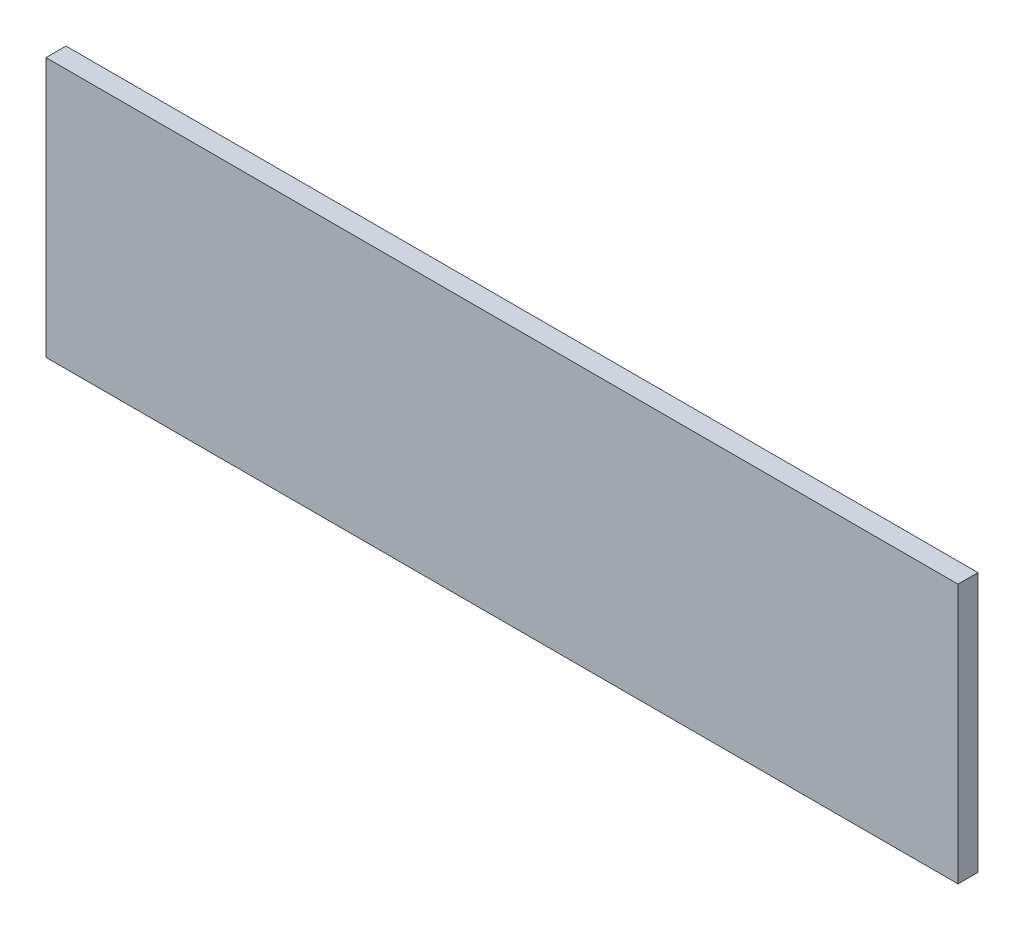
ISO-10303-21;
HEADER;
FILE_DESCRIPTION(('STEP AP214'),'2;1');
FILE_NAME('part.step','',(''),(''),'','','');
FILE_SCHEMA(('AUTOMOTIVE_DESIGN { 1 0 10303 214 1 1 1 1 }'));
ENDSEC;
DATA;
#1=APPLICATION_CONTEXT('core data for automotive mechanical design processes');
#2=APPLICATION_PROTOCOL_DEFINITION('international standard','automotive_design',2000,#1);
#3=PRODUCT_CONTEXT('',#1,'mechanical');
#4=PRODUCT('Part','Part','',(#3));
#5=PRODUCT_RELATED_PRODUCT_CATEGORY('part','',(#4));
#6=PRODUCT_DEFINITION_FORMATION('','',#4);
#7=PRODUCT_DEFINITION_CONTEXT('part definition',#1,'design');
#8=PRODUCT_DEFINITION('design','',#6,#7);
#9=PRODUCT_DEFINITION_SHAPE('','',#8);
#10=(LENGTH_UNIT() NAMED_UNIT(*) SI_UNIT(.MILLI.,.METRE.));
#11=(NAMED_UNIT(*) PLANE_ANGLE_UNIT() SI_UNIT($,.RADIAN.));
#12=(NAMED_UNIT(*) SI_UNIT($,.STERADIAN.) SOLID_ANGLE_UNIT());
#13=UNCERTAINTY_MEASURE_WITH_UNIT(LENGTH_MEASURE(1.E-05),#10,'distance_accuracy_value','');
#14=(GEOMETRIC_REPRESENTATION_CONTEXT(3) GLOBAL_UNCERTAINTY_ASSIGNED_CONTEXT((#13)) GLOBAL_UNIT_ASSIGNED_CONTEXT((#10,
#11,#12)) REPRESENTATION_CONTEXT('',''));
#15=CARTESIAN_POINT('',(0.,0.,0.));
#16=DIRECTION('',(0.,0.,1.));
#17=DIRECTION('',(1.,0.,0.));
#18=AXIS2_PLACEMENT_3D('',#15,#16,#17);
#19=CARTESIAN_POINT('',(137.,-39.,6.));
#20=DIRECTION('',(-1.,0.,0.));
#21=DIRECTION('',(0.,0.,1.));
#22=AXIS2_PLACEMENT_3D('',#19,#20,#21);
#23=PLANE('',#22);
#24=DIRECTION('',(0.,1.,0.));
#25=VECTOR('',#24,1.);
#26=CARTESIAN_POINT('',(137.,-39.,0.));
#27=LINE('',#26,#25);
#28=CARTESIAN_POINT('',(137.,-39.,0.));
#29=VERTEX_POINT('',#28);
#30=CARTESIAN_POINT('',(137.,39.,0.));
#31=VERTEX_POINT('',#30);
#32=EDGE_CURVE('E97',#29,#31,#27,.T.);
#33=ORIENTED_EDGE('',*,*,#32,.T.);
#34=DIRECTION('',(0.,0.,-1.));
#35=VECTOR('',#34,1.);
#36=CARTESIAN_POINT('',(137.,39.,6.));
#37=LINE('',#36,#35);
#38=CARTESIAN_POINT('',(137.,39.,6.));
#39=VERTEX_POINT('',#38);
#40=EDGE_CURVE('E11',#39,#31,#37,.T.);
#41=ORIENTED_EDGE('',*,*,#40,.F.);
#42=DIRECTION('',(0.,1.,0.));
#43=VECTOR('',#42,1.);
#44=CARTESIAN_POINT('',(137.,-39.,6.));
#45=LINE('',#44,#43);
#46=CARTESIAN_POINT('',(137.,-39.,6.));
#47=VERTEX_POINT('',#46);
#48=EDGE_CURVE('E85',#47,#39,#45,.T.);
#49=ORIENTED_EDGE('',*,*,#48,.F.);
#50=DIRECTION('',(0.,0.,-1.));
#51=VECTOR('',#50,1.);
#52=CARTESIAN_POINT('',(137.,-39.,6.));
#53=LINE('',#52,#51);
#54=EDGE_CURVE('E93',#47,#29,#53,.T.);
#55=ORIENTED_EDGE('',*,*,#54,.T.);
#56=EDGE_LOOP('',(#33,#41,#49,#55));
#57=FACE_BOUND('',#56,.T.);
#58=ADVANCED_FACE('F34',(#57),#23,.F.);
#59=CARTESIAN_POINT('',(-137.,39.,6.));
#60=DIRECTION('',(0.,-1.,0.));
#61=DIRECTION('',(0.,0.,-1.));
#62=AXIS2_PLACEMENT_3D('',#59,#60,#61);
#63=PLANE('',#62);
#64=DIRECTION('',(-1.,0.,0.));
#65=VECTOR('',#64,1.);
#66=CARTESIAN_POINT('',(-137.,39.,0.));
#67=LINE('',#66,#65);
#68=CARTESIAN_POINT('',(-137.,39.,0.));
#69=VERTEX_POINT('',#68);
#70=EDGE_CURVE('E89',#31,#69,#67,.T.);
#71=ORIENTED_EDGE('',*,*,#70,.T.);
#72=DIRECTION('',(0.,0.,-1.));
#73=VECTOR('',#72,1.);
#74=CARTESIAN_POINT('',(-137.,39.,6.));
#75=LINE('',#74,#73);
#76=CARTESIAN_POINT('',(-137.,39.,6.));
#77=VERTEX_POINT('',#76);
#78=EDGE_CURVE('E42',#77,#69,#75,.T.);
#79=ORIENTED_EDGE('',*,*,#78,.F.);
#80=DIRECTION('',(-1.,0.,0.));
#81=VECTOR('',#80,1.);
#82=CARTESIAN_POINT('',(-137.,39.,6.));
#83=LINE('',#82,#81);
#84=EDGE_CURVE('E80',#39,#77,#83,.T.);
#85=ORIENTED_EDGE('',*,*,#84,.F.);
#86=ORIENTED_EDGE('',*,*,#40,.T.);
#87=EDGE_LOOP('',(#71,#79,#85,#86));
#88=FACE_BOUND('',#87,.T.);
#89=ADVANCED_FACE('F88',(#88),#63,.F.);
#90=CARTESIAN_POINT('',(-137.,-39.,6.));
#91=DIRECTION('',(1.,0.,0.));
#92=DIRECTION('',(0.,0.,-1.));
#93=AXIS2_PLACEMENT_3D('',#90,#91,#92);
#94=PLANE('',#93);
#95=DIRECTION('',(0.,-1.,0.));
#96=VECTOR('',#95,1.);
#97=CARTESIAN_POINT('',(-137.,-39.,0.));
#98=LINE('',#97,#96);
#99=CARTESIAN_POINT('',(-137.,-39.,0.));
#100=VERTEX_POINT('',#99);
#101=EDGE_CURVE('E67',#69,#100,#98,.T.);
#102=ORIENTED_EDGE('',*,*,#101,.T.);
#103=DIRECTION('',(0.,0.,-1.));
#104=VECTOR('',#103,1.);
#105=CARTESIAN_POINT('',(-137.,-39.,6.));
#106=LINE('',#105,#104);
#107=CARTESIAN_POINT('',(-137.,-39.,6.));
#108=VERTEX_POINT('',#107);
#109=EDGE_CURVE('E90',#108,#100,#106,.T.);
#110=ORIENTED_EDGE('',*,*,#109,.F.);
#111=DIRECTION('',(0.,-1.,0.));
#112=VECTOR('',#111,1.);
#113=CARTESIAN_POINT('',(-137.,-39.,6.));
#114=LINE('',#113,#112);
#115=EDGE_CURVE('E83',#77,#108,#114,.T.);
#116=ORIENTED_EDGE('',*,*,#115,.F.);
#117=ORIENTED_EDGE('',*,*,#78,.T.);
#118=EDGE_LOOP('',(#102,#110,#116,#117));
#119=FACE_BOUND('',#118,.T.);
#120=ADVANCED_FACE('F91',(#119),#94,.F.);
#121=CARTESIAN_POINT('',(-137.,-39.,6.));
#122=DIRECTION('',(0.,1.,0.));
#123=DIRECTION('',(0.,0.,1.));
#124=AXIS2_PLACEMENT_3D('',#121,#122,#123);
#125=PLANE('',#124);
#126=DIRECTION('',(1.,0.,0.));
#127=VECTOR('',#126,1.);
#128=CARTESIAN_POINT('',(-137.,-39.,0.));
#129=LINE('',#128,#127);
#130=EDGE_CURVE('E73',#100,#29,#129,.T.);
#131=ORIENTED_EDGE('',*,*,#130,.T.);
#132=ORIENTED_EDGE('',*,*,#54,.F.);
#133=DIRECTION('',(1.,0.,0.));
#134=VECTOR('',#133,1.);
#135=CARTESIAN_POINT('',(-137.,-39.,6.));
#136=LINE('',#135,#134);
#137=EDGE_CURVE('E50',#108,#47,#136,.T.);
#138=ORIENTED_EDGE('',*,*,#137,.F.);
#139=ORIENTED_EDGE('',*,*,#109,.T.);
#140=EDGE_LOOP('',(#131,#132,#138,#139));
#141=FACE_BOUND('',#140,.T.);
#142=ADVANCED_FACE('F104',(#141),#125,.F.);
#143=CARTESIAN_POINT('',(0.,0.,6.));
#144=DIRECTION('',(0.,0.,-1.));
#145=DIRECTION('',(-1.,0.,0.));
#146=AXIS2_PLACEMENT_3D('',#143,#144,#145);
#147=PLANE('',#146);
#148=ORIENTED_EDGE('',*,*,#48,.T.);
#149=ORIENTED_EDGE('',*,*,#84,.T.);
#150=ORIENTED_EDGE('',*,*,#115,.T.);
#151=ORIENTED_EDGE('',*,*,#137,.T.);
#152=EDGE_LOOP('',(#148,#149,#150,#151));
#153=FACE_BOUND('',#152,.T.);
#154=ADVANCED_FACE('F81',(#153),#147,.F.);
#155=CARTESIAN_POINT('',(0.,0.,0.));
#156=DIRECTION('',(0.,0.,-1.));
#157=DIRECTION('',(-1.,0.,0.));
#158=AXIS2_PLACEMENT_3D('',#155,#156,#157);
#159=PLANE('',#158);
#160=ORIENTED_EDGE('',*,*,#32,.F.);
#161=ORIENTED_EDGE('',*,*,#130,.F.);
#162=ORIENTED_EDGE('',*,*,#101,.F.);
#163=ORIENTED_EDGE('',*,*,#70,.F.);
#164=EDGE_LOOP('',(#160,#161,#162,#163));
#165=FACE_BOUND('',#164,.T.);
#166=ADVANCED_FACE('F107',(#165),#159,.T.);
#167=CLOSED_SHELL('',(#58,#89,#120,#142,#154,#166));
#168=MANIFOLD_SOLID_BREP('B2',#167);
#169=ADVANCED_BREP_SHAPE_REPRESENTATION('',(#18,#168),#14);
#170=SHAPE_DEFINITION_REPRESENTATION(#9,#169);
ENDSEC;
END-ISO-10303-21;
